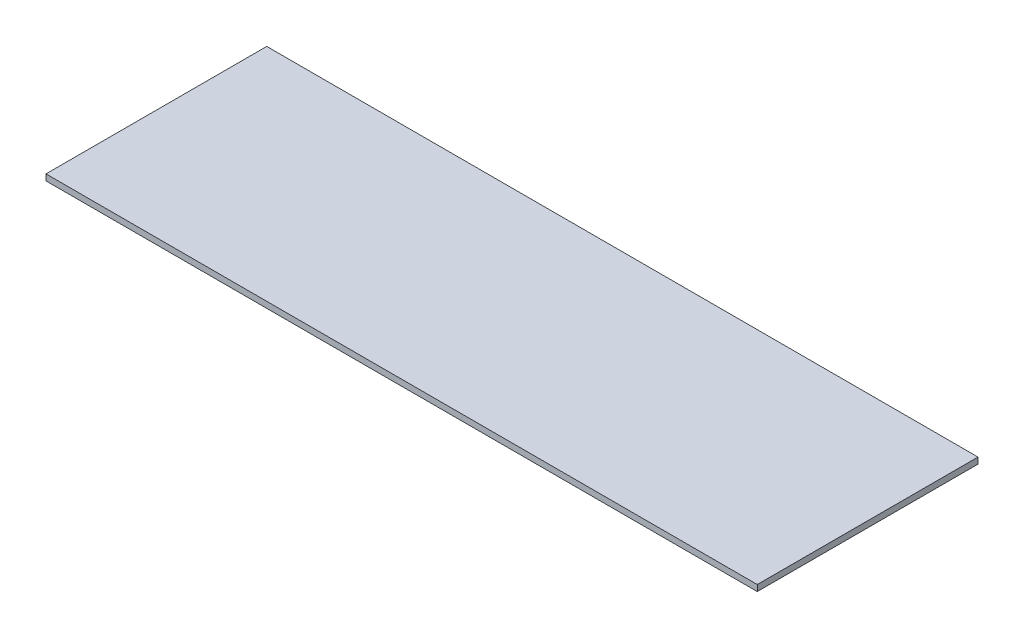
ISO-10303-21;
HEADER;
FILE_DESCRIPTION(('STEP AP214'),'2;1');
FILE_NAME('part.step','',(''),(''),'','','');
FILE_SCHEMA(('AUTOMOTIVE_DESIGN { 1 0 10303 214 1 1 1 1 }'));
ENDSEC;
DATA;
#1=APPLICATION_CONTEXT('core data for automotive mechanical design processes');
#2=APPLICATION_PROTOCOL_DEFINITION('international standard','automotive_design',2000,#1);
#3=PRODUCT_CONTEXT('',#1,'mechanical');
#4=PRODUCT('Part','Part','',(#3));
#5=PRODUCT_RELATED_PRODUCT_CATEGORY('part','',(#4));
#6=PRODUCT_DEFINITION_FORMATION('','',#4);
#7=PRODUCT_DEFINITION_CONTEXT('part definition',#1,'design');
#8=PRODUCT_DEFINITION('design','',#6,#7);
#9=PRODUCT_DEFINITION_SHAPE('','',#8);
#10=(LENGTH_UNIT() NAMED_UNIT(*) SI_UNIT(.MILLI.,.METRE.));
#11=(NAMED_UNIT(*) PLANE_ANGLE_UNIT() SI_UNIT($,.RADIAN.));
#12=(NAMED_UNIT(*) SI_UNIT($,.STERADIAN.) SOLID_ANGLE_UNIT());
#13=UNCERTAINTY_MEASURE_WITH_UNIT(LENGTH_MEASURE(1.E-05),#10,'distance_accuracy_value','');
#14=(GEOMETRIC_REPRESENTATION_CONTEXT(3) GLOBAL_UNCERTAINTY_ASSIGNED_CONTEXT((#13)) GLOBAL_UNIT_ASSIGNED_CONTEXT((#10,
#11,#12)) REPRESENTATION_CONTEXT('',''));
#15=CARTESIAN_POINT('',(0.,0.,0.));
#16=DIRECTION('',(0.,0.,1.));
#17=DIRECTION('',(1.,0.,0.));
#18=AXIS2_PLACEMENT_3D('',#15,#16,#17);
#19=CARTESIAN_POINT('',(0.,5.,0.));
#20=DIRECTION('',(1.,0.,0.));
#21=DIRECTION('',(0.,0.,-1.));
#22=AXIS2_PLACEMENT_3D('',#19,#20,#21);
#23=PLANE('',#22);
#24=DIRECTION('',(0.,0.,1.));
#25=VECTOR('',#24,1.);
#26=CARTESIAN_POINT('',(0.,0.,0.));
#27=LINE('',#26,#25);
#28=CARTESIAN_POINT('',(0.,0.,-180.));
#29=VERTEX_POINT('',#28);
#30=CARTESIAN_POINT('',(0.,0.,0.));
#31=VERTEX_POINT('',#30);
#32=EDGE_CURVE('E98',#29,#31,#27,.T.);
#33=ORIENTED_EDGE('',*,*,#32,.T.);
#34=DIRECTION('',(0.,-1.,0.));
#35=VECTOR('',#34,1.);
#36=CARTESIAN_POINT('',(0.,5.,0.));
#37=LINE('',#36,#35);
#38=CARTESIAN_POINT('',(0.,5.,0.));
#39=VERTEX_POINT('',#38);
#40=EDGE_CURVE('E11',#39,#31,#37,.T.);
#41=ORIENTED_EDGE('',*,*,#40,.F.);
#42=DIRECTION('',(0.,0.,1.));
#43=VECTOR('',#42,1.);
#44=CARTESIAN_POINT('',(0.,5.,0.));
#45=LINE('',#44,#43);
#46=CARTESIAN_POINT('',(0.,5.,-180.));
#47=VERTEX_POINT('',#46);
#48=EDGE_CURVE('E86',#47,#39,#45,.T.);
#49=ORIENTED_EDGE('',*,*,#48,.F.);
#50=DIRECTION('',(0.,-1.,0.));
#51=VECTOR('',#50,1.);
#52=CARTESIAN_POINT('',(0.,5.,-180.));
#53=LINE('',#52,#51);
#54=EDGE_CURVE('E94',#47,#29,#53,.T.);
#55=ORIENTED_EDGE('',*,*,#54,.T.);
#56=EDGE_LOOP('',(#33,#41,#49,#55));
#57=FACE_BOUND('',#56,.T.);
#58=ADVANCED_FACE('F35',(#57),#23,.F.);
#59=CARTESIAN_POINT('',(0.,5.,0.));
#60=DIRECTION('',(0.,0.,-1.));
#61=DIRECTION('',(-1.,0.,0.));
#62=AXIS2_PLACEMENT_3D('',#59,#60,#61);
#63=PLANE('',#62);
#64=DIRECTION('',(1.,0.,0.));
#65=VECTOR('',#64,1.);
#66=CARTESIAN_POINT('',(0.,0.,0.));
#67=LINE('',#66,#65);
#68=CARTESIAN_POINT('',(580.,0.,0.));
#69=VERTEX_POINT('',#68);
#70=EDGE_CURVE('E90',#31,#69,#67,.T.);
#71=ORIENTED_EDGE('',*,*,#70,.T.);
#72=DIRECTION('',(0.,-1.,0.));
#73=VECTOR('',#72,1.);
#74=CARTESIAN_POINT('',(580.,5.,0.));
#75=LINE('',#74,#73);
#76=CARTESIAN_POINT('',(580.,5.,0.));
#77=VERTEX_POINT('',#76);
#78=EDGE_CURVE('E43',#77,#69,#75,.T.);
#79=ORIENTED_EDGE('',*,*,#78,.F.);
#80=DIRECTION('',(1.,0.,0.));
#81=VECTOR('',#80,1.);
#82=CARTESIAN_POINT('',(0.,5.,0.));
#83=LINE('',#82,#81);
#84=EDGE_CURVE('E81',#39,#77,#83,.T.);
#85=ORIENTED_EDGE('',*,*,#84,.F.);
#86=ORIENTED_EDGE('',*,*,#40,.T.);
#87=EDGE_LOOP('',(#71,#79,#85,#86));
#88=FACE_BOUND('',#87,.T.);
#89=ADVANCED_FACE('F89',(#88),#63,.F.);
#90=CARTESIAN_POINT('',(580.,5.,0.));
#91=DIRECTION('',(-1.,0.,0.));
#92=DIRECTION('',(0.,0.,1.));
#93=AXIS2_PLACEMENT_3D('',#90,#91,#92);
#94=PLANE('',#93);
#95=DIRECTION('',(0.,0.,-1.));
#96=VECTOR('',#95,1.);
#97=CARTESIAN_POINT('',(580.,0.,0.));
#98=LINE('',#97,#96);
#99=CARTESIAN_POINT('',(580.,0.,-180.));
#100=VERTEX_POINT('',#99);
#101=EDGE_CURVE('E68',#69,#100,#98,.T.);
#102=ORIENTED_EDGE('',*,*,#101,.T.);
#103=DIRECTION('',(0.,-1.,0.));
#104=VECTOR('',#103,1.);
#105=CARTESIAN_POINT('',(580.,5.,-180.));
#106=LINE('',#105,#104);
#107=CARTESIAN_POINT('',(580.,5.,-180.));
#108=VERTEX_POINT('',#107);
#109=EDGE_CURVE('E91',#108,#100,#106,.T.);
#110=ORIENTED_EDGE('',*,*,#109,.F.);
#111=DIRECTION('',(0.,0.,-1.));
#112=VECTOR('',#111,1.);
#113=CARTESIAN_POINT('',(580.,5.,0.));
#114=LINE('',#113,#112);
#115=EDGE_CURVE('E84',#77,#108,#114,.T.);
#116=ORIENTED_EDGE('',*,*,#115,.F.);
#117=ORIENTED_EDGE('',*,*,#78,.T.);
#118=EDGE_LOOP('',(#102,#110,#116,#117));
#119=FACE_BOUND('',#118,.T.);
#120=ADVANCED_FACE('F92',(#119),#94,.F.);
#121=CARTESIAN_POINT('',(0.,5.,-180.));
#122=DIRECTION('',(0.,0.,1.));
#123=DIRECTION('',(1.,0.,0.));
#124=AXIS2_PLACEMENT_3D('',#121,#122,#123);
#125=PLANE('',#124);
#126=DIRECTION('',(-1.,0.,0.));
#127=VECTOR('',#126,1.);
#128=CARTESIAN_POINT('',(0.,0.,-180.));
#129=LINE('',#128,#127);
#130=EDGE_CURVE('E74',#100,#29,#129,.T.);
#131=ORIENTED_EDGE('',*,*,#130,.T.);
#132=ORIENTED_EDGE('',*,*,#54,.F.);
#133=DIRECTION('',(-1.,0.,0.));
#134=VECTOR('',#133,1.);
#135=CARTESIAN_POINT('',(0.,5.,-180.));
#136=LINE('',#135,#134);
#137=EDGE_CURVE('E51',#108,#47,#136,.T.);
#138=ORIENTED_EDGE('',*,*,#137,.F.);
#139=ORIENTED_EDGE('',*,*,#109,.T.);
#140=EDGE_LOOP('',(#131,#132,#138,#139));
#141=FACE_BOUND('',#140,.T.);
#142=ADVANCED_FACE('F105',(#141),#125,.F.);
#143=CARTESIAN_POINT('',(0.,5.,0.));
#144=DIRECTION('',(0.,-1.,0.));
#145=DIRECTION('',(0.,0.,-1.));
#146=AXIS2_PLACEMENT_3D('',#143,#144,#145);
#147=PLANE('',#146);
#148=ORIENTED_EDGE('',*,*,#48,.T.);
#149=ORIENTED_EDGE('',*,*,#84,.T.);
#150=ORIENTED_EDGE('',*,*,#115,.T.);
#151=ORIENTED_EDGE('',*,*,#137,.T.);
#152=EDGE_LOOP('',(#148,#149,#150,#151));
#153=FACE_BOUND('',#152,.T.);
#154=ADVANCED_FACE('F82',(#153),#147,.F.);
#155=CARTESIAN_POINT('',(0.,0.,0.));
#156=DIRECTION('',(0.,-1.,0.));
#157=DIRECTION('',(0.,0.,-1.));
#158=AXIS2_PLACEMENT_3D('',#155,#156,#157);
#159=PLANE('',#158);
#160=ORIENTED_EDGE('',*,*,#32,.F.);
#161=ORIENTED_EDGE('',*,*,#130,.F.);
#162=ORIENTED_EDGE('',*,*,#101,.F.);
#163=ORIENTED_EDGE('',*,*,#70,.F.);
#164=EDGE_LOOP('',(#160,#161,#162,#163));
#165=FACE_BOUND('',#164,.T.);
#166=ADVANCED_FACE('F108',(#165),#159,.T.);
#167=CLOSED_SHELL('',(#58,#89,#120,#142,#154,#166));
#168=MANIFOLD_SOLID_BREP('B2',#167);
#169=ADVANCED_BREP_SHAPE_REPRESENTATION('',(#18,#168),#14);
#170=SHAPE_DEFINITION_REPRESENTATION(#9,#169);
ENDSEC;
END-ISO-10303-21;
